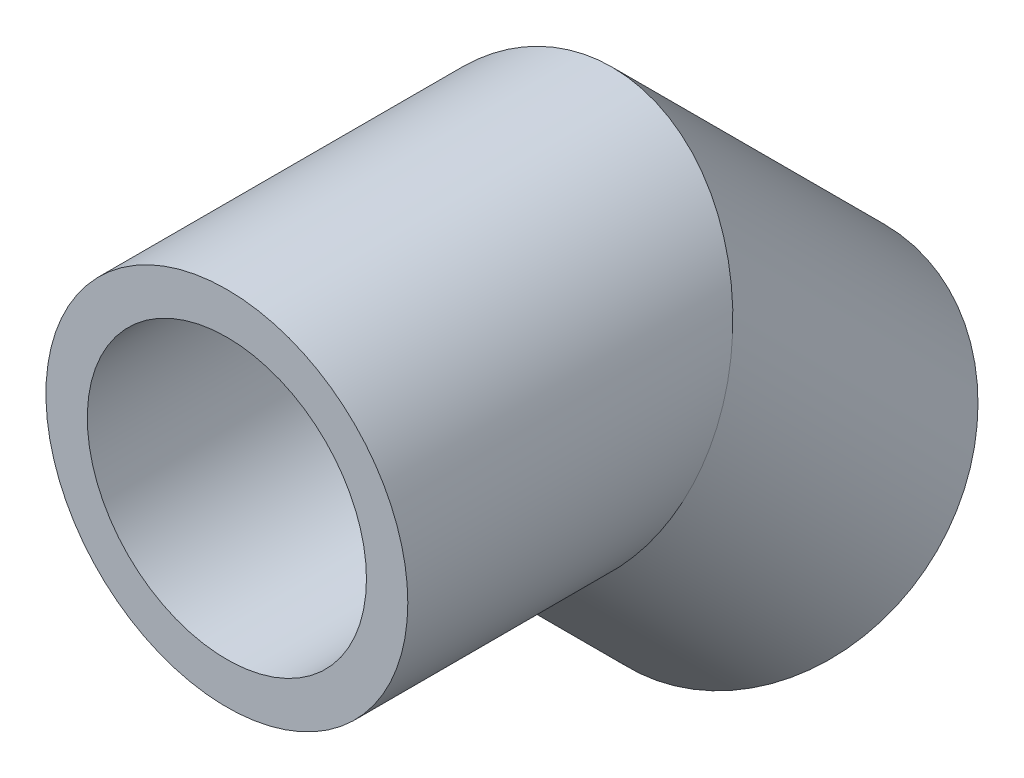
ISO-10303-21;
HEADER;
FILE_DESCRIPTION(('STEP AP214'),'2;1');
FILE_NAME('part.step','',(''),(''),'','','');
FILE_SCHEMA(('AUTOMOTIVE_DESIGN { 1 0 10303 214 1 1 1 1 }'));
ENDSEC;
DATA;
#1=APPLICATION_CONTEXT('core data for automotive mechanical design processes');
#2=APPLICATION_PROTOCOL_DEFINITION('international standard','automotive_design',2000,#1);
#3=PRODUCT_CONTEXT('',#1,'mechanical');
#4=PRODUCT('Part','Part','',(#3));
#5=PRODUCT_RELATED_PRODUCT_CATEGORY('part','',(#4));
#6=PRODUCT_DEFINITION_FORMATION('','',#4);
#7=PRODUCT_DEFINITION_CONTEXT('part definition',#1,'design');
#8=PRODUCT_DEFINITION('design','',#6,#7);
#9=PRODUCT_DEFINITION_SHAPE('','',#8);
#10=(LENGTH_UNIT() NAMED_UNIT(*) SI_UNIT(.MILLI.,.METRE.));
#11=(NAMED_UNIT(*) PLANE_ANGLE_UNIT() SI_UNIT($,.RADIAN.));
#12=(NAMED_UNIT(*) SI_UNIT($,.STERADIAN.) SOLID_ANGLE_UNIT());
#13=UNCERTAINTY_MEASURE_WITH_UNIT(LENGTH_MEASURE(1.E-05),#10,'distance_accuracy_value','');
#14=(GEOMETRIC_REPRESENTATION_CONTEXT(3) GLOBAL_UNCERTAINTY_ASSIGNED_CONTEXT((#13)) GLOBAL_UNIT_ASSIGNED_CONTEXT((#10,
#11,#12)) REPRESENTATION_CONTEXT('',''));
#15=CARTESIAN_POINT('',(0.,0.,0.));
#16=DIRECTION('',(0.,0.,1.));
#17=DIRECTION('',(1.,0.,0.));
#18=AXIS2_PLACEMENT_3D('',#15,#16,#17);
#19=CARTESIAN_POINT('',(0.,11.3470996024364,-18.6529003975635));
#20=DIRECTION('',(0.,-0.707106781186544,-0.707106781186551));
#21=DIRECTION('',(0.,0.707106781186551,-0.707106781186544));
#22=AXIS2_PLACEMENT_3D('',#19,#20,#21);
#23=CYLINDRICAL_SURFACE('',#22,17.5);
#24=CARTESIAN_POINT('',(0.,0.,-30.));
#25=DIRECTION('',(0.,-0.382683432365087,-0.923879532511288));
#26=DIRECTION('',(0.,0.923879532511288,-0.382683432365087));
#27=AXIS2_PLACEMENT_3D('',#24,#25,#26);
#28=ELLIPSE('',#27,18.9418635051169,17.5);
#29=CARTESIAN_POINT('',(0.,17.5,-37.2487373415291));
#30=VERTEX_POINT('',#29);
#31=EDGE_CURVE('E34',#30,#30,#28,.T.);
#32=ORIENTED_EDGE('',*,*,#31,.T.);
#33=EDGE_LOOP('',(#32));
#34=FACE_BOUND('',#33,.T.);
#35=CARTESIAN_POINT('',(0.,-21.2132034355963,-51.2132034355965));
#36=DIRECTION('',(0.,0.707106781186544,0.707106781186551));
#37=DIRECTION('',(1.,0.,0.));
#38=AXIS2_PLACEMENT_3D('',#35,#36,#37);
#39=CIRCLE('',#38,17.5);
#40=CARTESIAN_POINT('',(17.5,-21.2132034355963,-51.2132034355965));
#41=VERTEX_POINT('',#40);
#42=EDGE_CURVE('E50',#41,#41,#39,.T.);
#43=ORIENTED_EDGE('',*,*,#42,.T.);
#44=EDGE_LOOP('',(#43));
#45=FACE_BOUND('',#44,.T.);
#46=ADVANCED_FACE('F31',(#34,#45),#23,.T.);
#47=CARTESIAN_POINT('',(0.,0.,0.));
#48=DIRECTION('',(0.,0.,-1.));
#49=DIRECTION('',(-1.,0.,0.));
#50=AXIS2_PLACEMENT_3D('',#47,#48,#49);
#51=CYLINDRICAL_SURFACE('',#50,17.5);
#52=CARTESIAN_POINT('',(0.,0.,0.));
#53=DIRECTION('',(0.,0.,1.));
#54=DIRECTION('',(1.,0.,0.));
#55=AXIS2_PLACEMENT_3D('',#52,#53,#54);
#56=CIRCLE('',#55,17.5);
#57=CARTESIAN_POINT('',(17.5,0.,0.));
#58=VERTEX_POINT('',#57);
#59=EDGE_CURVE('E48',#58,#58,#56,.T.);
#60=ORIENTED_EDGE('',*,*,#59,.F.);
#61=EDGE_LOOP('',(#60));
#62=FACE_BOUND('',#61,.T.);
#63=ORIENTED_EDGE('',*,*,#31,.F.);
#64=EDGE_LOOP('',(#63));
#65=FACE_BOUND('',#64,.T.);
#66=ADVANCED_FACE('F58',(#62,#65),#51,.T.);
#67=CARTESIAN_POINT('',(0.,-21.2132034355963,-51.2132034355965));
#68=DIRECTION('',(0.,0.707106781186544,0.707106781186551));
#69=DIRECTION('',(1.,0.,0.));
#70=AXIS2_PLACEMENT_3D('',#67,#68,#69);
#71=PLANE('',#70);
#72=CARTESIAN_POINT('',(0.,-21.2132034355963,-51.2132034355965));
#73=DIRECTION('',(0.,0.707106781186544,0.707106781186551));
#74=DIRECTION('',(1.,0.,0.));
#75=AXIS2_PLACEMENT_3D('',#72,#73,#74);
#76=CIRCLE('',#75,13.5);
#77=CARTESIAN_POINT('',(13.5,-21.2132034355963,-51.2132034355965));
#78=VERTEX_POINT('',#77);
#79=EDGE_CURVE('E43',#78,#78,#76,.F.);
#80=ORIENTED_EDGE('',*,*,#79,.F.);
#81=EDGE_LOOP('',(#80));
#82=FACE_BOUND('',#81,.T.);
#83=ORIENTED_EDGE('',*,*,#42,.F.);
#84=EDGE_LOOP('',(#83));
#85=FACE_BOUND('',#84,.T.);
#86=ADVANCED_FACE('F60',(#82,#85),#71,.F.);
#87=CARTESIAN_POINT('',(0.,0.,0.));
#88=DIRECTION('',(0.,0.,1.));
#89=DIRECTION('',(1.,0.,0.));
#90=AXIS2_PLACEMENT_3D('',#87,#88,#89);
#91=PLANE('',#90);
#92=CARTESIAN_POINT('',(0.,0.,0.));
#93=DIRECTION('',(0.,0.,1.));
#94=DIRECTION('',(1.,0.,0.));
#95=AXIS2_PLACEMENT_3D('',#92,#93,#94);
#96=CIRCLE('',#95,13.5);
#97=CARTESIAN_POINT('',(13.5,0.,0.));
#98=VERTEX_POINT('',#97);
#99=EDGE_CURVE('E38',#98,#98,#96,.F.);
#100=ORIENTED_EDGE('',*,*,#99,.T.);
#101=EDGE_LOOP('',(#100));
#102=FACE_BOUND('',#101,.T.);
#103=ORIENTED_EDGE('',*,*,#59,.T.);
#104=EDGE_LOOP('',(#103));
#105=FACE_BOUND('',#104,.T.);
#106=ADVANCED_FACE('F66',(#102,#105),#91,.T.);
#107=CARTESIAN_POINT('',(0.,8.76963927687807,-21.2303607231218));
#108=DIRECTION('',(0.,-0.707106781186544,-0.707106781186551));
#109=DIRECTION('',(0.,0.707106781186551,-0.707106781186544));
#110=AXIS2_PLACEMENT_3D('',#107,#108,#109);
#111=CYLINDRICAL_SURFACE('',#110,13.5);
#112=CARTESIAN_POINT('',(0.,0.,-30.));
#113=DIRECTION('',(0.,-0.382683432365087,-0.923879532511288));
#114=DIRECTION('',(0.,0.923879532511288,-0.382683432365087));
#115=AXIS2_PLACEMENT_3D('',#112,#113,#114);
#116=ELLIPSE('',#115,14.6122947039473,13.5);
#117=CARTESIAN_POINT('',(0.,13.5,-35.5918830920367));
#118=VERTEX_POINT('',#117);
#119=EDGE_CURVE('E10',#118,#118,#116,.F.);
#120=ORIENTED_EDGE('',*,*,#119,.T.);
#121=EDGE_LOOP('',(#120));
#122=FACE_BOUND('',#121,.T.);
#123=ORIENTED_EDGE('',*,*,#79,.T.);
#124=EDGE_LOOP('',(#123));
#125=FACE_BOUND('',#124,.T.);
#126=ADVANCED_FACE('F72',(#122,#125),#111,.F.);
#127=CARTESIAN_POINT('',(0.,0.,0.));
#128=DIRECTION('',(0.,0.,-1.));
#129=DIRECTION('',(-1.,0.,0.));
#130=AXIS2_PLACEMENT_3D('',#127,#128,#129);
#131=CYLINDRICAL_SURFACE('',#130,13.5);
#132=ORIENTED_EDGE('',*,*,#99,.F.);
#133=EDGE_LOOP('',(#132));
#134=FACE_BOUND('',#133,.T.);
#135=ORIENTED_EDGE('',*,*,#119,.F.);
#136=EDGE_LOOP('',(#135));
#137=FACE_BOUND('',#136,.T.);
#138=ADVANCED_FACE('F70',(#134,#137),#131,.F.);
#139=CLOSED_SHELL('',(#46,#66,#86,#106,#126,#138));
#140=MANIFOLD_SOLID_BREP('B2',#139);
#141=ADVANCED_BREP_SHAPE_REPRESENTATION('',(#18,#140),#14);
#142=SHAPE_DEFINITION_REPRESENTATION(#9,#141);
ENDSEC;
END-ISO-10303-21;
